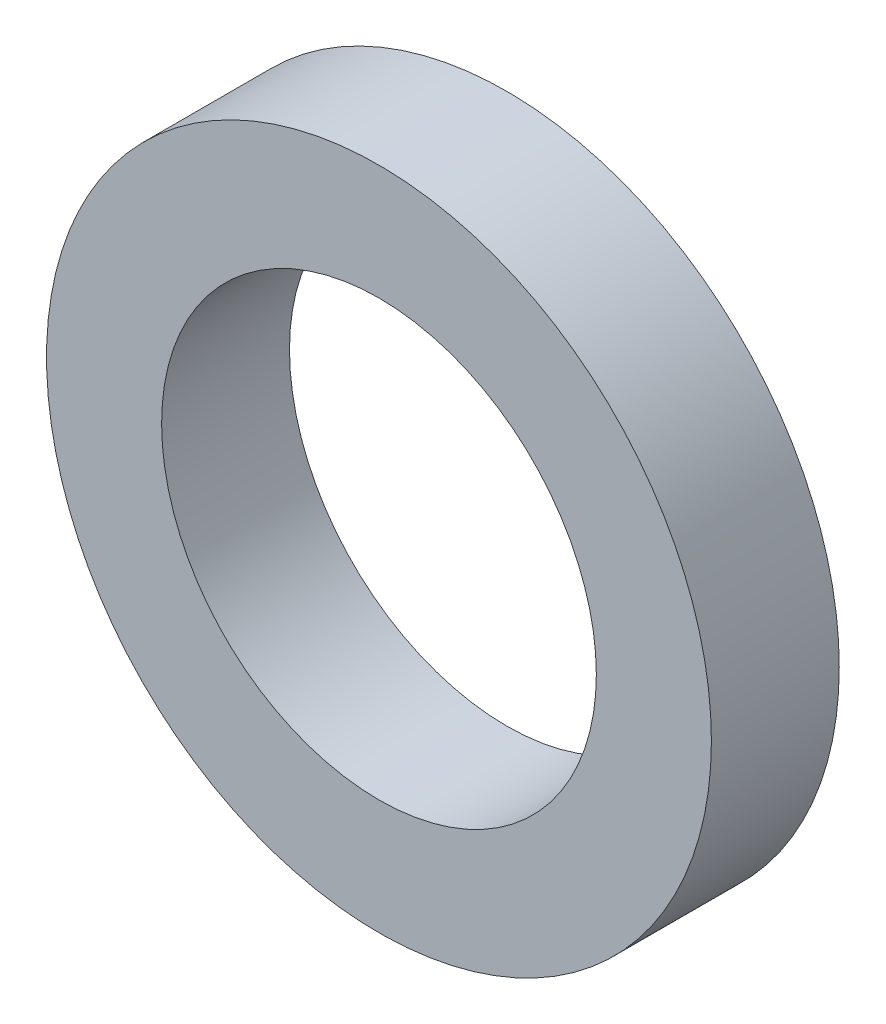
ISO-10303-21;
HEADER;
FILE_DESCRIPTION(('STEP AP214'),'2;1');
FILE_NAME('part.step','',(''),(''),'','','');
FILE_SCHEMA(('AUTOMOTIVE_DESIGN { 1 0 10303 214 1 1 1 1 }'));
ENDSEC;
DATA;
#1=APPLICATION_CONTEXT('core data for automotive mechanical design processes');
#2=APPLICATION_PROTOCOL_DEFINITION('international standard','automotive_design',2000,#1);
#3=PRODUCT_CONTEXT('',#1,'mechanical');
#4=PRODUCT('Part','Part','',(#3));
#5=PRODUCT_RELATED_PRODUCT_CATEGORY('part','',(#4));
#6=PRODUCT_DEFINITION_FORMATION('','',#4);
#7=PRODUCT_DEFINITION_CONTEXT('part definition',#1,'design');
#8=PRODUCT_DEFINITION('design','',#6,#7);
#9=PRODUCT_DEFINITION_SHAPE('','',#8);
#10=(LENGTH_UNIT() NAMED_UNIT(*) SI_UNIT(.MILLI.,.METRE.));
#11=(NAMED_UNIT(*) PLANE_ANGLE_UNIT() SI_UNIT($,.RADIAN.));
#12=(NAMED_UNIT(*) SI_UNIT($,.STERADIAN.) SOLID_ANGLE_UNIT());
#13=UNCERTAINTY_MEASURE_WITH_UNIT(LENGTH_MEASURE(1.E-05),#10,'distance_accuracy_value','');
#14=(GEOMETRIC_REPRESENTATION_CONTEXT(3) GLOBAL_UNCERTAINTY_ASSIGNED_CONTEXT((#13)) GLOBAL_UNIT_ASSIGNED_CONTEXT((#10,
#11,#12)) REPRESENTATION_CONTEXT('',''));
#15=CARTESIAN_POINT('',(0.,0.,0.));
#16=DIRECTION('',(0.,0.,1.));
#17=DIRECTION('',(1.,0.,0.));
#18=AXIS2_PLACEMENT_3D('',#15,#16,#17);
#19=CARTESIAN_POINT('',(0.,0.,5.));
#20=DIRECTION('',(0.,0.,1.));
#21=DIRECTION('',(1.,0.,0.));
#22=AXIS2_PLACEMENT_3D('',#19,#20,#21);
#23=PLANE('',#22);
#24=CARTESIAN_POINT('',(0.,0.,5.));
#25=DIRECTION('',(0.,0.,1.));
#26=DIRECTION('',(1.,0.,0.));
#27=AXIS2_PLACEMENT_3D('',#24,#25,#26);
#28=CIRCLE('',#27,13.);
#29=CARTESIAN_POINT('',(13.,0.,5.));
#30=VERTEX_POINT('',#29);
#31=EDGE_CURVE('E10',#30,#30,#28,.T.);
#32=ORIENTED_EDGE('',*,*,#31,.T.);
#33=EDGE_LOOP('',(#32));
#34=FACE_BOUND('',#33,.T.);
#35=CARTESIAN_POINT('',(0.,0.,5.));
#36=DIRECTION('',(0.,0.,1.));
#37=DIRECTION('',(1.,0.,0.));
#38=AXIS2_PLACEMENT_3D('',#35,#36,#37);
#39=CIRCLE('',#38,8.5);
#40=CARTESIAN_POINT('',(8.5,0.,5.));
#41=VERTEX_POINT('',#40);
#42=EDGE_CURVE('E56',#41,#41,#39,.T.);
#43=ORIENTED_EDGE('',*,*,#42,.F.);
#44=EDGE_LOOP('',(#43));
#45=FACE_BOUND('',#44,.T.);
#46=ADVANCED_FACE('F43',(#34,#45),#23,.T.);
#47=CARTESIAN_POINT('',(0.,0.,0.));
#48=DIRECTION('',(0.,0.,1.));
#49=DIRECTION('',(1.,0.,0.));
#50=AXIS2_PLACEMENT_3D('',#47,#48,#49);
#51=PLANE('',#50);
#52=CARTESIAN_POINT('',(0.,0.,0.));
#53=DIRECTION('',(0.,0.,1.));
#54=DIRECTION('',(1.,0.,0.));
#55=AXIS2_PLACEMENT_3D('',#52,#53,#54);
#56=CIRCLE('',#55,13.);
#57=CARTESIAN_POINT('',(13.,0.,0.));
#58=VERTEX_POINT('',#57);
#59=EDGE_CURVE('E47',#58,#58,#56,.T.);
#60=ORIENTED_EDGE('',*,*,#59,.F.);
#61=EDGE_LOOP('',(#60));
#62=FACE_BOUND('',#61,.T.);
#63=CARTESIAN_POINT('',(0.,0.,0.));
#64=DIRECTION('',(0.,0.,1.));
#65=DIRECTION('',(1.,0.,0.));
#66=AXIS2_PLACEMENT_3D('',#63,#64,#65);
#67=CIRCLE('',#66,8.5);
#68=CARTESIAN_POINT('',(8.5,0.,0.));
#69=VERTEX_POINT('',#68);
#70=EDGE_CURVE('E58',#69,#69,#67,.T.);
#71=ORIENTED_EDGE('',*,*,#70,.T.);
#72=EDGE_LOOP('',(#71));
#73=FACE_BOUND('',#72,.T.);
#74=ADVANCED_FACE('F70',(#62,#73),#51,.F.);
#75=CARTESIAN_POINT('',(0.,0.,5.));
#76=DIRECTION('',(0.,0.,-1.));
#77=DIRECTION('',(-1.,0.,0.));
#78=AXIS2_PLACEMENT_3D('',#75,#76,#77);
#79=CYLINDRICAL_SURFACE('',#78,13.);
#80=ORIENTED_EDGE('',*,*,#31,.F.);
#81=EDGE_LOOP('',(#80));
#82=FACE_BOUND('',#81,.T.);
#83=ORIENTED_EDGE('',*,*,#59,.T.);
#84=EDGE_LOOP('',(#83));
#85=FACE_BOUND('',#84,.T.);
#86=ADVANCED_FACE('F45',(#82,#85),#79,.T.);
#87=CARTESIAN_POINT('',(0.,0.,5.));
#88=DIRECTION('',(0.,0.,-1.));
#89=DIRECTION('',(-1.,0.,0.));
#90=AXIS2_PLACEMENT_3D('',#87,#88,#89);
#91=CYLINDRICAL_SURFACE('',#90,8.5);
#92=ORIENTED_EDGE('',*,*,#42,.T.);
#93=EDGE_LOOP('',(#92));
#94=FACE_BOUND('',#93,.T.);
#95=ORIENTED_EDGE('',*,*,#70,.F.);
#96=EDGE_LOOP('',(#95));
#97=FACE_BOUND('',#96,.T.);
#98=ADVANCED_FACE('F66',(#94,#97),#91,.F.);
#99=CLOSED_SHELL('',(#46,#74,#86,#98));
#100=MANIFOLD_SOLID_BREP('B2',#99);
#101=ADVANCED_BREP_SHAPE_REPRESENTATION('',(#18,#100),#14);
#102=SHAPE_DEFINITION_REPRESENTATION(#9,#101);
ENDSEC;
END-ISO-10303-21;
